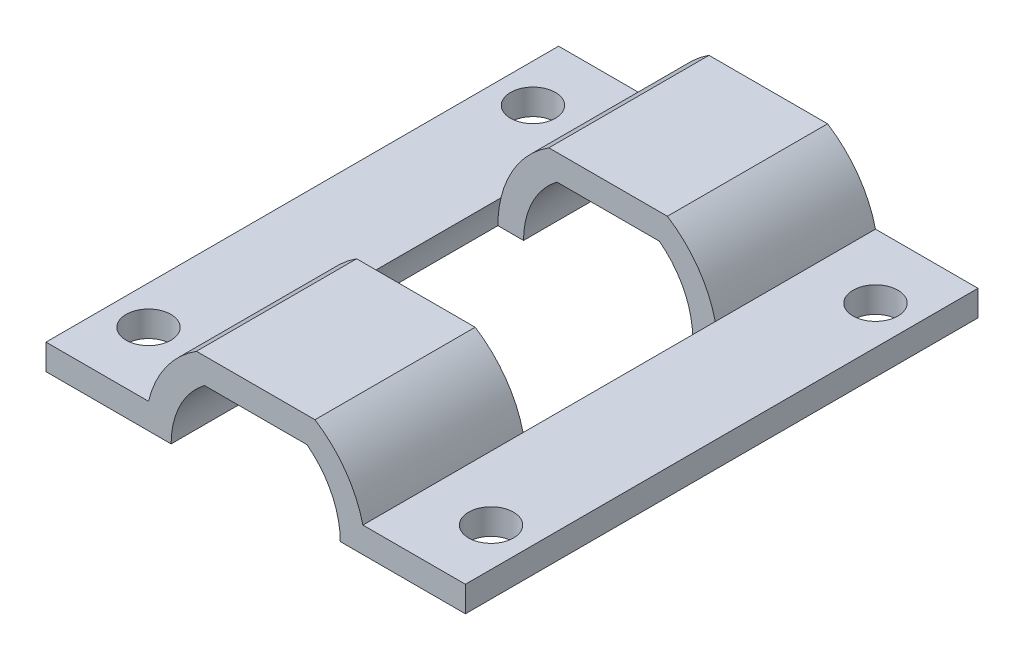
ISO-10303-21;
HEADER;
FILE_DESCRIPTION(('STEP AP214'),'2;1');
FILE_NAME('part.step','',(''),(''),'','','');
FILE_SCHEMA(('AUTOMOTIVE_DESIGN { 1 0 10303 214 1 1 1 1 }'));
ENDSEC;
DATA;
#1=APPLICATION_CONTEXT('core data for automotive mechanical design processes');
#2=APPLICATION_PROTOCOL_DEFINITION('international standard','automotive_design',2000,#1);
#3=PRODUCT_CONTEXT('',#1,'mechanical');
#4=PRODUCT('Part','Part','',(#3));
#5=PRODUCT_RELATED_PRODUCT_CATEGORY('part','',(#4));
#6=PRODUCT_DEFINITION_FORMATION('','',#4);
#7=PRODUCT_DEFINITION_CONTEXT('part definition',#1,'design');
#8=PRODUCT_DEFINITION('design','',#6,#7);
#9=PRODUCT_DEFINITION_SHAPE('','',#8);
#10=(LENGTH_UNIT() NAMED_UNIT(*) SI_UNIT(.MILLI.,.METRE.));
#11=(NAMED_UNIT(*) PLANE_ANGLE_UNIT() SI_UNIT($,.RADIAN.));
#12=(NAMED_UNIT(*) SI_UNIT($,.STERADIAN.) SOLID_ANGLE_UNIT());
#13=UNCERTAINTY_MEASURE_WITH_UNIT(LENGTH_MEASURE(1.E-05),#10,'distance_accuracy_value','');
#14=(GEOMETRIC_REPRESENTATION_CONTEXT(3) GLOBAL_UNCERTAINTY_ASSIGNED_CONTEXT((#13)) GLOBAL_UNIT_ASSIGNED_CONTEXT((#10,
#11,#12)) REPRESENTATION_CONTEXT('',''));
#15=CARTESIAN_POINT('',(0.,0.,0.));
#16=DIRECTION('',(0.,0.,1.));
#17=DIRECTION('',(1.,0.,0.));
#18=AXIS2_PLACEMENT_3D('',#15,#16,#17);
#19=CARTESIAN_POINT('',(0.,0.,20.));
#20=DIRECTION('',(0.,0.,-1.));
#21=DIRECTION('',(-1.,0.,0.));
#22=AXIS2_PLACEMENT_3D('',#19,#20,#21);
#23=CYLINDRICAL_SURFACE('',#22,8.6);
#24=CARTESIAN_POINT('',(0.,0.,-7.5));
#25=DIRECTION('',(0.,0.,1.));
#26=DIRECTION('',(1.,0.,0.));
#27=AXIS2_PLACEMENT_3D('',#24,#25,#26);
#28=CIRCLE('',#27,8.6);
#29=CARTESIAN_POINT('',(-4.62574318353278,7.25,-7.5));
#30=VERTEX_POINT('',#29);
#31=CARTESIAN_POINT('',(-8.36420946653059,2.,-7.5));
#32=VERTEX_POINT('',#31);
#33=EDGE_CURVE('E58',#30,#32,#28,.T.);
#34=ORIENTED_EDGE('',*,*,#33,.F.);
#35=DIRECTION('',(0.,0.,-1.));
#36=VECTOR('',#35,1.);
#37=CARTESIAN_POINT('',(-4.62574318353278,7.25,20.));
#38=LINE('',#37,#36);
#39=CARTESIAN_POINT('',(-4.62574318353278,7.25,-20.));
#40=VERTEX_POINT('',#39);
#41=EDGE_CURVE('E289',#30,#40,#38,.T.);
#42=ORIENTED_EDGE('',*,*,#41,.T.);
#43=CARTESIAN_POINT('',(0.,0.,-20.));
#44=DIRECTION('',(0.,0.,1.));
#45=DIRECTION('',(1.,0.,0.));
#46=AXIS2_PLACEMENT_3D('',#43,#44,#45);
#47=CIRCLE('',#46,8.6);
#48=CARTESIAN_POINT('',(-8.36420946653059,2.,-20.));
#49=VERTEX_POINT('',#48);
#50=EDGE_CURVE('E262',#40,#49,#47,.T.);
#51=ORIENTED_EDGE('',*,*,#50,.T.);
#52=DIRECTION('',(0.,0.,-1.));
#53=VECTOR('',#52,1.);
#54=CARTESIAN_POINT('',(-8.36420946653059,2.,20.));
#55=LINE('',#54,#53);
#56=EDGE_CURVE('E231',#32,#49,#55,.T.);
#57=ORIENTED_EDGE('',*,*,#56,.F.);
#58=EDGE_LOOP('',(#34,#42,#51,#57));
#59=FACE_BOUND('',#58,.T.);
#60=ADVANCED_FACE('F35',(#59),#23,.T.);
#61=CARTESIAN_POINT('',(0.,0.,20.));
#62=DIRECTION('',(0.,1.,0.));
#63=DIRECTION('',(0.,0.,1.));
#64=AXIS2_PLACEMENT_3D('',#61,#62,#63);
#65=PLANE('',#64);
#66=CARTESIAN_POINT('',(13.3642094665306,0.,-15.));
#67=DIRECTION('',(0.,-1.,0.));
#68=DIRECTION('',(0.,0.,1.));
#69=AXIS2_PLACEMENT_3D('',#66,#67,#68);
#70=CIRCLE('',#69,1.75);
#71=CARTESIAN_POINT('',(13.3642094665306,0.,-13.25));
#72=VERTEX_POINT('',#71);
#73=EDGE_CURVE('E479',#72,#72,#70,.T.);
#74=ORIENTED_EDGE('',*,*,#73,.F.);
#75=EDGE_LOOP('',(#74));
#76=FACE_BOUND('',#75,.T.);
#77=CARTESIAN_POINT('',(13.3642094665306,0.,15.));
#78=DIRECTION('',(0.,-1.,0.));
#79=DIRECTION('',(0.,0.,1.));
#80=AXIS2_PLACEMENT_3D('',#77,#78,#79);
#81=CIRCLE('',#80,1.75);
#82=CARTESIAN_POINT('',(13.3642094665306,0.,16.75));
#83=VERTEX_POINT('',#82);
#84=EDGE_CURVE('E486',#83,#83,#81,.T.);
#85=ORIENTED_EDGE('',*,*,#84,.F.);
#86=EDGE_LOOP('',(#85));
#87=FACE_BOUND('',#86,.T.);
#88=DIRECTION('',(-1.,0.,0.));
#89=VECTOR('',#88,1.);
#90=CARTESIAN_POINT('',(0.,0.,-7.5));
#91=LINE('',#90,#89);
#92=CARTESIAN_POINT('',(8.6,0.,-7.5));
#93=VERTEX_POINT('',#92);
#94=CARTESIAN_POINT('',(6.6,0.,-7.5));
#95=VERTEX_POINT('',#94);
#96=EDGE_CURVE('E184',#93,#95,#91,.T.);
#97=ORIENTED_EDGE('',*,*,#96,.T.);
#98=DIRECTION('',(0.,0.,-1.));
#99=VECTOR('',#98,1.);
#100=CARTESIAN_POINT('',(6.6,0.,20.));
#101=LINE('',#100,#99);
#102=CARTESIAN_POINT('',(6.6,0.,-20.));
#103=VERTEX_POINT('',#102);
#104=EDGE_CURVE('E256',#95,#103,#101,.T.);
#105=ORIENTED_EDGE('',*,*,#104,.T.);
#106=DIRECTION('',(1.,0.,0.));
#107=VECTOR('',#106,1.);
#108=CARTESIAN_POINT('',(0.,0.,-20.));
#109=LINE('',#108,#107);
#110=CARTESIAN_POINT('',(16.3642094665306,0.,-20.));
#111=VERTEX_POINT('',#110);
#112=EDGE_CURVE('E297',#103,#111,#109,.T.);
#113=ORIENTED_EDGE('',*,*,#112,.T.);
#114=DIRECTION('',(0.,0.,-1.));
#115=VECTOR('',#114,1.);
#116=CARTESIAN_POINT('',(16.3642094665306,0.,20.));
#117=LINE('',#116,#115);
#118=CARTESIAN_POINT('',(16.3642094665306,0.,20.));
#119=VERTEX_POINT('',#118);
#120=EDGE_CURVE('E11',#119,#111,#117,.T.);
#121=ORIENTED_EDGE('',*,*,#120,.F.);
#122=DIRECTION('',(1.,0.,0.));
#123=VECTOR('',#122,1.);
#124=CARTESIAN_POINT('',(0.,0.,20.));
#125=LINE('',#124,#123);
#126=CARTESIAN_POINT('',(6.6,0.,20.));
#127=VERTEX_POINT('',#126);
#128=EDGE_CURVE('E298',#127,#119,#125,.T.);
#129=ORIENTED_EDGE('',*,*,#128,.F.);
#130=CARTESIAN_POINT('',(6.6,0.,7.5));
#131=VERTEX_POINT('',#130);
#132=EDGE_CURVE('E275',#127,#131,#101,.T.);
#133=ORIENTED_EDGE('',*,*,#132,.T.);
#134=DIRECTION('',(-1.,0.,0.));
#135=VECTOR('',#134,1.);
#136=CARTESIAN_POINT('',(0.,0.,7.5));
#137=LINE('',#136,#135);
#138=CARTESIAN_POINT('',(8.6,0.,7.5));
#139=VERTEX_POINT('',#138);
#140=EDGE_CURVE('E50',#139,#131,#137,.T.);
#141=ORIENTED_EDGE('',*,*,#140,.F.);
#142=DIRECTION('',(0.,0.,1.));
#143=VECTOR('',#142,1.);
#144=CARTESIAN_POINT('',(8.6,0.,-7.5));
#145=LINE('',#144,#143);
#146=EDGE_CURVE('E200',#93,#139,#145,.T.);
#147=ORIENTED_EDGE('',*,*,#146,.F.);
#148=EDGE_LOOP('',(#97,#105,#113,#121,#129,#133,#141,#147));
#149=FACE_BOUND('',#148,.T.);
#150=ADVANCED_FACE('F37',(#76,#87,#149),#65,.F.);
#151=CARTESIAN_POINT('',(0.,0.,20.));
#152=DIRECTION('',(0.,0.,-1.));
#153=DIRECTION('',(-1.,0.,0.));
#154=AXIS2_PLACEMENT_3D('',#151,#152,#153);
#155=CYLINDRICAL_SURFACE('',#154,8.6);
#156=CARTESIAN_POINT('',(0.,0.,-7.5));
#157=DIRECTION('',(0.,0.,1.));
#158=DIRECTION('',(1.,0.,0.));
#159=AXIS2_PLACEMENT_3D('',#156,#157,#158);
#160=CIRCLE('',#159,8.6);
#161=CARTESIAN_POINT('',(8.36420946653059,2.,-7.5));
#162=VERTEX_POINT('',#161);
#163=CARTESIAN_POINT('',(4.62574318353278,7.25,-7.5));
#164=VERTEX_POINT('',#163);
#165=EDGE_CURVE('E194',#162,#164,#160,.T.);
#166=ORIENTED_EDGE('',*,*,#165,.F.);
#167=DIRECTION('',(0.,0.,-1.));
#168=VECTOR('',#167,1.);
#169=CARTESIAN_POINT('',(8.36420946653059,2.,20.));
#170=LINE('',#169,#168);
#171=CARTESIAN_POINT('',(8.36420946653059,2.,-20.));
#172=VERTEX_POINT('',#171);
#173=EDGE_CURVE('E306',#162,#172,#170,.T.);
#174=ORIENTED_EDGE('',*,*,#173,.T.);
#175=CARTESIAN_POINT('',(0.,0.,-20.));
#176=DIRECTION('',(0.,0.,1.));
#177=DIRECTION('',(1.,0.,0.));
#178=AXIS2_PLACEMENT_3D('',#175,#176,#177);
#179=CIRCLE('',#178,8.6);
#180=CARTESIAN_POINT('',(4.62574318353278,7.25,-20.));
#181=VERTEX_POINT('',#180);
#182=EDGE_CURVE('E235',#172,#181,#179,.T.);
#183=ORIENTED_EDGE('',*,*,#182,.T.);
#184=DIRECTION('',(0.,0.,-1.));
#185=VECTOR('',#184,1.);
#186=CARTESIAN_POINT('',(4.62574318353278,7.25,20.));
#187=LINE('',#186,#185);
#188=EDGE_CURVE('E293',#164,#181,#187,.T.);
#189=ORIENTED_EDGE('',*,*,#188,.F.);
#190=EDGE_LOOP('',(#166,#174,#183,#189));
#191=FACE_BOUND('',#190,.T.);
#192=ADVANCED_FACE('F335',(#191),#155,.T.);
#193=CARTESIAN_POINT('',(0.,7.25,20.));
#194=DIRECTION('',(0.,1.,0.));
#195=DIRECTION('',(0.,0.,1.));
#196=AXIS2_PLACEMENT_3D('',#193,#194,#195);
#197=PLANE('',#196);
#198=ORIENTED_EDGE('',*,*,#41,.F.);
#199=DIRECTION('',(1.,0.,0.));
#200=VECTOR('',#199,1.);
#201=CARTESIAN_POINT('',(0.,7.25,-7.5));
#202=LINE('',#201,#200);
#203=EDGE_CURVE('E203',#30,#164,#202,.T.);
#204=ORIENTED_EDGE('',*,*,#203,.T.);
#205=ORIENTED_EDGE('',*,*,#188,.T.);
#206=DIRECTION('',(1.,0.,0.));
#207=VECTOR('',#206,1.);
#208=CARTESIAN_POINT('',(0.,7.25,-20.));
#209=LINE('',#208,#207);
#210=EDGE_CURVE('E259',#40,#181,#209,.T.);
#211=ORIENTED_EDGE('',*,*,#210,.F.);
#212=EDGE_LOOP('',(#198,#204,#205,#211));
#213=FACE_BOUND('',#212,.T.);
#214=ADVANCED_FACE('F379',(#213),#197,.T.);
#215=CARTESIAN_POINT('',(0.,0.,20.));
#216=DIRECTION('',(0.,-1.,0.));
#217=DIRECTION('',(1.,0.,0.));
#218=AXIS2_PLACEMENT_3D('',#215,#216,#217);
#219=PLANE('',#218);
#220=CARTESIAN_POINT('',(-13.3642094665306,0.,-15.));
#221=DIRECTION('',(0.,1.,0.));
#222=DIRECTION('',(0.,0.,1.));
#223=AXIS2_PLACEMENT_3D('',#220,#221,#222);
#224=CIRCLE('',#223,1.75);
#225=CARTESIAN_POINT('',(-13.3642094665306,0.,-13.25));
#226=VERTEX_POINT('',#225);
#227=EDGE_CURVE('E390',#226,#226,#224,.T.);
#228=ORIENTED_EDGE('',*,*,#227,.T.);
#229=EDGE_LOOP('',(#228));
#230=FACE_BOUND('',#229,.T.);
#231=CARTESIAN_POINT('',(-13.3642094665306,0.,15.));
#232=DIRECTION('',(0.,1.,0.));
#233=DIRECTION('',(0.,0.,1.));
#234=AXIS2_PLACEMENT_3D('',#231,#232,#233);
#235=CIRCLE('',#234,1.75);
#236=CARTESIAN_POINT('',(-13.3642094665306,0.,16.75));
#237=VERTEX_POINT('',#236);
#238=EDGE_CURVE('E471',#237,#237,#235,.T.);
#239=ORIENTED_EDGE('',*,*,#238,.T.);
#240=EDGE_LOOP('',(#239));
#241=FACE_BOUND('',#240,.T.);
#242=DIRECTION('',(0.,0.,-1.));
#243=VECTOR('',#242,1.);
#244=CARTESIAN_POINT('',(-6.6,0.,20.));
#245=LINE('',#244,#243);
#246=CARTESIAN_POINT('',(-6.6,0.,-7.5));
#247=VERTEX_POINT('',#246);
#248=CARTESIAN_POINT('',(-6.6,0.,-20.));
#249=VERTEX_POINT('',#248);
#250=EDGE_CURVE('E285',#247,#249,#245,.T.);
#251=ORIENTED_EDGE('',*,*,#250,.F.);
#252=DIRECTION('',(-1.,0.,0.));
#253=VECTOR('',#252,1.);
#254=CARTESIAN_POINT('',(0.,0.,-7.5));
#255=LINE('',#254,#253);
#256=CARTESIAN_POINT('',(-8.6,0.,-7.5));
#257=VERTEX_POINT('',#256);
#258=EDGE_CURVE('E385',#247,#257,#255,.T.);
#259=ORIENTED_EDGE('',*,*,#258,.T.);
#260=DIRECTION('',(0.,0.,1.));
#261=VECTOR('',#260,1.);
#262=CARTESIAN_POINT('',(-8.6,0.,-7.5));
#263=LINE('',#262,#261);
#264=CARTESIAN_POINT('',(-8.6,0.,7.5));
#265=VERTEX_POINT('',#264);
#266=EDGE_CURVE('E206',#257,#265,#263,.T.);
#267=ORIENTED_EDGE('',*,*,#266,.T.);
#268=DIRECTION('',(-1.,0.,0.));
#269=VECTOR('',#268,1.);
#270=CARTESIAN_POINT('',(0.,0.,7.5));
#271=LINE('',#270,#269);
#272=CARTESIAN_POINT('',(-6.6,0.,7.5));
#273=VERTEX_POINT('',#272);
#274=EDGE_CURVE('E399',#273,#265,#271,.T.);
#275=ORIENTED_EDGE('',*,*,#274,.F.);
#276=CARTESIAN_POINT('',(-6.6,0.,20.));
#277=VERTEX_POINT('',#276);
#278=EDGE_CURVE('E286',#277,#273,#245,.T.);
#279=ORIENTED_EDGE('',*,*,#278,.F.);
#280=DIRECTION('',(-1.,0.,0.));
#281=VECTOR('',#280,1.);
#282=CARTESIAN_POINT('',(0.,0.,20.));
#283=LINE('',#282,#281);
#284=CARTESIAN_POINT('',(-16.3642094665306,0.,20.));
#285=VERTEX_POINT('',#284);
#286=EDGE_CURVE('E246',#277,#285,#283,.T.);
#287=ORIENTED_EDGE('',*,*,#286,.T.);
#288=DIRECTION('',(0.,0.,-1.));
#289=VECTOR('',#288,1.);
#290=CARTESIAN_POINT('',(-16.3642094665306,0.,20.));
#291=LINE('',#290,#289);
#292=CARTESIAN_POINT('',(-16.3642094665306,0.,-20.));
#293=VERTEX_POINT('',#292);
#294=EDGE_CURVE('E222',#285,#293,#291,.T.);
#295=ORIENTED_EDGE('',*,*,#294,.T.);
#296=DIRECTION('',(-1.,0.,0.));
#297=VECTOR('',#296,1.);
#298=CARTESIAN_POINT('',(0.,0.,-20.));
#299=LINE('',#298,#297);
#300=EDGE_CURVE('E265',#249,#293,#299,.T.);
#301=ORIENTED_EDGE('',*,*,#300,.F.);
#302=EDGE_LOOP('',(#251,#259,#267,#275,#279,#287,#295,#301));
#303=FACE_BOUND('',#302,.T.);
#304=ADVANCED_FACE('F364',(#230,#241,#303),#219,.T.);
#305=CARTESIAN_POINT('',(0.,0.,20.));
#306=DIRECTION('',(0.,0.,-1.));
#307=DIRECTION('',(-1.,0.,0.));
#308=AXIS2_PLACEMENT_3D('',#305,#306,#307);
#309=CYLINDRICAL_SURFACE('',#308,6.6);
#310=DIRECTION('',(0.,0.,-1.));
#311=VECTOR('',#310,1.);
#312=CARTESIAN_POINT('',(-3.99968748779202,5.25,20.));
#313=LINE('',#312,#311);
#314=CARTESIAN_POINT('',(-3.99968748779202,5.25,-7.5));
#315=VERTEX_POINT('',#314);
#316=CARTESIAN_POINT('',(-3.99968748779202,5.25,-20.));
#317=VERTEX_POINT('',#316);
#318=EDGE_CURVE('E281',#315,#317,#313,.T.);
#319=ORIENTED_EDGE('',*,*,#318,.F.);
#320=CARTESIAN_POINT('',(0.,0.,-7.5));
#321=DIRECTION('',(0.,0.,1.));
#322=DIRECTION('',(1.,0.,0.));
#323=AXIS2_PLACEMENT_3D('',#320,#321,#322);
#324=CIRCLE('',#323,6.6);
#325=EDGE_CURVE('E361',#315,#247,#324,.T.);
#326=ORIENTED_EDGE('',*,*,#325,.T.);
#327=ORIENTED_EDGE('',*,*,#250,.T.);
#328=CARTESIAN_POINT('',(0.,0.,-20.));
#329=DIRECTION('',(0.,0.,1.));
#330=DIRECTION('',(1.,0.,0.));
#331=AXIS2_PLACEMENT_3D('',#328,#329,#330);
#332=CIRCLE('',#331,6.6);
#333=EDGE_CURVE('E267',#317,#249,#332,.T.);
#334=ORIENTED_EDGE('',*,*,#333,.F.);
#335=EDGE_LOOP('',(#319,#326,#327,#334));
#336=FACE_BOUND('',#335,.T.);
#337=ADVANCED_FACE('F357',(#336),#309,.F.);
#338=CARTESIAN_POINT('',(0.,5.25,20.));
#339=DIRECTION('',(0.,1.,0.));
#340=DIRECTION('',(0.,0.,1.));
#341=AXIS2_PLACEMENT_3D('',#338,#339,#340);
#342=PLANE('',#341);
#343=DIRECTION('',(1.,0.,0.));
#344=VECTOR('',#343,1.);
#345=CARTESIAN_POINT('',(0.,5.25,-7.5));
#346=LINE('',#345,#344);
#347=CARTESIAN_POINT('',(3.99968748779202,5.25,-7.5));
#348=VERTEX_POINT('',#347);
#349=EDGE_CURVE('E210',#315,#348,#346,.T.);
#350=ORIENTED_EDGE('',*,*,#349,.F.);
#351=ORIENTED_EDGE('',*,*,#318,.T.);
#352=DIRECTION('',(1.,0.,0.));
#353=VECTOR('',#352,1.);
#354=CARTESIAN_POINT('',(0.,5.25,-20.));
#355=LINE('',#354,#353);
#356=CARTESIAN_POINT('',(3.99968748779202,5.25,-20.));
#357=VERTEX_POINT('',#356);
#358=EDGE_CURVE('E270',#317,#357,#355,.T.);
#359=ORIENTED_EDGE('',*,*,#358,.T.);
#360=DIRECTION('',(0.,0.,-1.));
#361=VECTOR('',#360,1.);
#362=CARTESIAN_POINT('',(3.99968748779202,5.25,20.));
#363=LINE('',#362,#361);
#364=EDGE_CURVE('E277',#348,#357,#363,.T.);
#365=ORIENTED_EDGE('',*,*,#364,.F.);
#366=EDGE_LOOP('',(#350,#351,#359,#365));
#367=FACE_BOUND('',#366,.T.);
#368=ADVANCED_FACE('F353',(#367),#342,.F.);
#369=CARTESIAN_POINT('',(0.,0.,20.));
#370=DIRECTION('',(0.,0.,-1.));
#371=DIRECTION('',(-1.,0.,0.));
#372=AXIS2_PLACEMENT_3D('',#369,#370,#371);
#373=CYLINDRICAL_SURFACE('',#372,6.6);
#374=ORIENTED_EDGE('',*,*,#104,.F.);
#375=CARTESIAN_POINT('',(0.,0.,-7.5));
#376=DIRECTION('',(0.,0.,1.));
#377=DIRECTION('',(1.,0.,0.));
#378=AXIS2_PLACEMENT_3D('',#375,#376,#377);
#379=CIRCLE('',#378,6.6);
#380=EDGE_CURVE('E190',#95,#348,#379,.T.);
#381=ORIENTED_EDGE('',*,*,#380,.T.);
#382=ORIENTED_EDGE('',*,*,#364,.T.);
#383=CARTESIAN_POINT('',(0.,0.,-20.));
#384=DIRECTION('',(0.,0.,1.));
#385=DIRECTION('',(1.,0.,0.));
#386=AXIS2_PLACEMENT_3D('',#383,#384,#385);
#387=CIRCLE('',#386,6.6);
#388=EDGE_CURVE('E240',#103,#357,#387,.T.);
#389=ORIENTED_EDGE('',*,*,#388,.F.);
#390=EDGE_LOOP('',(#374,#381,#382,#389));
#391=FACE_BOUND('',#390,.T.);
#392=ADVANCED_FACE('F349',(#391),#373,.F.);
#393=CARTESIAN_POINT('',(-4.62574318353278,7.25,20.));
#394=VERTEX_POINT('',#393);
#395=CARTESIAN_POINT('',(-4.62574318353278,7.25,7.5));
#396=VERTEX_POINT('',#395);
#397=EDGE_CURVE('E290',#394,#396,#38,.T.);
#398=ORIENTED_EDGE('',*,*,#397,.T.);
#399=CARTESIAN_POINT('',(0.,0.,7.5));
#400=DIRECTION('',(0.,0.,1.));
#401=DIRECTION('',(1.,0.,0.));
#402=AXIS2_PLACEMENT_3D('',#399,#400,#401);
#403=CIRCLE('',#402,8.6);
#404=CARTESIAN_POINT('',(-8.36420946653059,2.,7.5));
#405=VERTEX_POINT('',#404);
#406=EDGE_CURVE('E396',#396,#405,#403,.T.);
#407=ORIENTED_EDGE('',*,*,#406,.T.);
#408=CARTESIAN_POINT('',(-8.36420946653059,2.,20.));
#409=VERTEX_POINT('',#408);
#410=EDGE_CURVE('E232',#409,#405,#55,.T.);
#411=ORIENTED_EDGE('',*,*,#410,.F.);
#412=CARTESIAN_POINT('',(0.,0.,20.));
#413=DIRECTION('',(0.,0.,1.));
#414=DIRECTION('',(1.,0.,0.));
#415=AXIS2_PLACEMENT_3D('',#412,#413,#414);
#416=CIRCLE('',#415,8.6);
#417=EDGE_CURVE('E243',#394,#409,#416,.T.);
#418=ORIENTED_EDGE('',*,*,#417,.F.);
#419=EDGE_LOOP('',(#398,#407,#411,#418));
#420=FACE_BOUND('',#419,.T.);
#421=ADVANCED_FACE('F425',(#420),#23,.T.);
#422=CARTESIAN_POINT('',(16.3642094665306,0.,20.));
#423=DIRECTION('',(-1.,0.,0.));
#424=DIRECTION('',(0.,0.,1.));
#425=AXIS2_PLACEMENT_3D('',#422,#423,#424);
#426=PLANE('',#425);
#427=DIRECTION('',(0.,1.,0.));
#428=VECTOR('',#427,1.);
#429=CARTESIAN_POINT('',(16.3642094665306,0.,-20.));
#430=LINE('',#429,#428);
#431=CARTESIAN_POINT('',(16.3642094665306,2.,-20.));
#432=VERTEX_POINT('',#431);
#433=EDGE_CURVE('E308',#111,#432,#430,.T.);
#434=ORIENTED_EDGE('',*,*,#433,.T.);
#435=DIRECTION('',(0.,0.,-1.));
#436=VECTOR('',#435,1.);
#437=CARTESIAN_POINT('',(16.3642094665306,2.,20.));
#438=LINE('',#437,#436);
#439=CARTESIAN_POINT('',(16.3642094665306,2.,20.));
#440=VERTEX_POINT('',#439);
#441=EDGE_CURVE('E43',#440,#432,#438,.T.);
#442=ORIENTED_EDGE('',*,*,#441,.F.);
#443=DIRECTION('',(0.,1.,0.));
#444=VECTOR('',#443,1.);
#445=CARTESIAN_POINT('',(16.3642094665306,0.,20.));
#446=LINE('',#445,#444);
#447=EDGE_CURVE('E300',#119,#440,#446,.T.);
#448=ORIENTED_EDGE('',*,*,#447,.F.);
#449=ORIENTED_EDGE('',*,*,#120,.T.);
#450=EDGE_LOOP('',(#434,#442,#448,#449));
#451=FACE_BOUND('',#450,.T.);
#452=ADVANCED_FACE('F325',(#451),#426,.F.);
#453=CARTESIAN_POINT('',(0.,2.,20.));
#454=DIRECTION('',(0.,1.,0.));
#455=DIRECTION('',(0.,0.,1.));
#456=AXIS2_PLACEMENT_3D('',#453,#454,#455);
#457=PLANE('',#456);
#458=CARTESIAN_POINT('',(13.3642094665306,2.,-15.));
#459=DIRECTION('',(0.,-1.,0.));
#460=DIRECTION('',(0.,0.,1.));
#461=AXIS2_PLACEMENT_3D('',#458,#459,#460);
#462=CIRCLE('',#461,1.75);
#463=CARTESIAN_POINT('',(13.3642094665306,2.,-13.25));
#464=VERTEX_POINT('',#463);
#465=EDGE_CURVE('E489',#464,#464,#462,.T.);
#466=ORIENTED_EDGE('',*,*,#465,.T.);
#467=EDGE_LOOP('',(#466));
#468=FACE_BOUND('',#467,.T.);
#469=CARTESIAN_POINT('',(13.3642094665306,2.,15.));
#470=DIRECTION('',(0.,-1.,0.));
#471=DIRECTION('',(0.,0.,1.));
#472=AXIS2_PLACEMENT_3D('',#469,#470,#471);
#473=CIRCLE('',#472,1.75);
#474=CARTESIAN_POINT('',(13.3642094665306,2.,16.75));
#475=VERTEX_POINT('',#474);
#476=EDGE_CURVE('E483',#475,#475,#473,.T.);
#477=ORIENTED_EDGE('',*,*,#476,.T.);
#478=EDGE_LOOP('',(#477));
#479=FACE_BOUND('',#478,.T.);
#480=DIRECTION('',(1.,0.,0.));
#481=VECTOR('',#480,1.);
#482=CARTESIAN_POINT('',(0.,2.,-20.));
#483=LINE('',#482,#481);
#484=EDGE_CURVE('E301',#172,#432,#483,.T.);
#485=ORIENTED_EDGE('',*,*,#484,.F.);
#486=ORIENTED_EDGE('',*,*,#173,.F.);
#487=DIRECTION('',(0.,0.,1.));
#488=VECTOR('',#487,1.);
#489=CARTESIAN_POINT('',(8.36420946653059,2.,-7.5));
#490=LINE('',#489,#488);
#491=CARTESIAN_POINT('',(8.36420946653059,2.,7.5));
#492=VERTEX_POINT('',#491);
#493=EDGE_CURVE('E202',#492,#162,#490,.F.);
#494=ORIENTED_EDGE('',*,*,#493,.F.);
#495=CARTESIAN_POINT('',(8.36420946653059,2.,20.));
#496=VERTEX_POINT('',#495);
#497=EDGE_CURVE('E313',#496,#492,#170,.T.);
#498=ORIENTED_EDGE('',*,*,#497,.F.);
#499=DIRECTION('',(1.,0.,0.));
#500=VECTOR('',#499,1.);
#501=CARTESIAN_POINT('',(0.,2.,20.));
#502=LINE('',#501,#500);
#503=EDGE_CURVE('E303',#496,#440,#502,.T.);
#504=ORIENTED_EDGE('',*,*,#503,.T.);
#505=ORIENTED_EDGE('',*,*,#441,.T.);
#506=EDGE_LOOP('',(#485,#486,#494,#498,#504,#505));
#507=FACE_BOUND('',#506,.T.);
#508=ADVANCED_FACE('F318',(#468,#479,#507),#457,.T.);
#509=CARTESIAN_POINT('',(0.,0.,20.));
#510=DIRECTION('',(0.,0.,1.));
#511=DIRECTION('',(1.,0.,0.));
#512=AXIS2_PLACEMENT_3D('',#509,#510,#511);
#513=PLANE('',#512);
#514=ORIENTED_EDGE('',*,*,#503,.F.);
#515=CARTESIAN_POINT('',(0.,0.,20.));
#516=DIRECTION('',(0.,0.,1.));
#517=DIRECTION('',(1.,0.,0.));
#518=AXIS2_PLACEMENT_3D('',#515,#516,#517);
#519=CIRCLE('',#518,8.6);
#520=CARTESIAN_POINT('',(4.62574318353278,7.25,20.));
#521=VERTEX_POINT('',#520);
#522=EDGE_CURVE('E237',#496,#521,#519,.T.);
#523=ORIENTED_EDGE('',*,*,#522,.T.);
#524=DIRECTION('',(1.,0.,0.));
#525=VECTOR('',#524,1.);
#526=CARTESIAN_POINT('',(0.,7.25,20.));
#527=LINE('',#526,#525);
#528=EDGE_CURVE('E239',#394,#521,#527,.T.);
#529=ORIENTED_EDGE('',*,*,#528,.F.);
#530=ORIENTED_EDGE('',*,*,#417,.T.);
#531=DIRECTION('',(-1.,0.,0.));
#532=VECTOR('',#531,1.);
#533=CARTESIAN_POINT('',(0.,2.,20.));
#534=LINE('',#533,#532);
#535=CARTESIAN_POINT('',(-16.3642094665306,2.,20.));
#536=VERTEX_POINT('',#535);
#537=EDGE_CURVE('E216',#409,#536,#534,.T.);
#538=ORIENTED_EDGE('',*,*,#537,.T.);
#539=DIRECTION('',(0.,1.,0.));
#540=VECTOR('',#539,1.);
#541=CARTESIAN_POINT('',(-16.3642094665306,0.,20.));
#542=LINE('',#541,#540);
#543=EDGE_CURVE('E218',#285,#536,#542,.T.);
#544=ORIENTED_EDGE('',*,*,#543,.F.);
#545=ORIENTED_EDGE('',*,*,#286,.F.);
#546=CARTESIAN_POINT('',(0.,0.,20.));
#547=DIRECTION('',(0.,0.,1.));
#548=DIRECTION('',(1.,0.,0.));
#549=AXIS2_PLACEMENT_3D('',#546,#547,#548);
#550=CIRCLE('',#549,6.6);
#551=CARTESIAN_POINT('',(-3.99968748779202,5.25,20.));
#552=VERTEX_POINT('',#551);
#553=EDGE_CURVE('E248',#552,#277,#550,.T.);
#554=ORIENTED_EDGE('',*,*,#553,.F.);
#555=DIRECTION('',(1.,0.,0.));
#556=VECTOR('',#555,1.);
#557=CARTESIAN_POINT('',(0.,5.25,20.));
#558=LINE('',#557,#556);
#559=CARTESIAN_POINT('',(3.99968748779202,5.25,20.));
#560=VERTEX_POINT('',#559);
#561=EDGE_CURVE('E251',#552,#560,#558,.T.);
#562=ORIENTED_EDGE('',*,*,#561,.T.);
#563=CARTESIAN_POINT('',(0.,0.,20.));
#564=DIRECTION('',(0.,0.,1.));
#565=DIRECTION('',(1.,0.,0.));
#566=AXIS2_PLACEMENT_3D('',#563,#564,#565);
#567=CIRCLE('',#566,6.6);
#568=EDGE_CURVE('E253',#127,#560,#567,.T.);
#569=ORIENTED_EDGE('',*,*,#568,.F.);
#570=ORIENTED_EDGE('',*,*,#128,.T.);
#571=ORIENTED_EDGE('',*,*,#447,.T.);
#572=EDGE_LOOP('',(#514,#523,#529,#530,#538,#544,#545,#554,#562,#569,#570,#571));
#573=FACE_BOUND('',#572,.T.);
#574=ADVANCED_FACE('F343',(#573),#513,.T.);
#575=CARTESIAN_POINT('',(0.,0.,-20.));
#576=DIRECTION('',(0.,0.,1.));
#577=DIRECTION('',(1.,0.,0.));
#578=AXIS2_PLACEMENT_3D('',#575,#576,#577);
#579=PLANE('',#578);
#580=ORIENTED_EDGE('',*,*,#112,.F.);
#581=ORIENTED_EDGE('',*,*,#388,.T.);
#582=ORIENTED_EDGE('',*,*,#358,.F.);
#583=ORIENTED_EDGE('',*,*,#333,.T.);
#584=ORIENTED_EDGE('',*,*,#300,.T.);
#585=DIRECTION('',(0.,1.,0.));
#586=VECTOR('',#585,1.);
#587=CARTESIAN_POINT('',(-16.3642094665306,0.,-20.));
#588=LINE('',#587,#586);
#589=CARTESIAN_POINT('',(-16.3642094665306,2.,-20.));
#590=VERTEX_POINT('',#589);
#591=EDGE_CURVE('E219',#293,#590,#588,.T.);
#592=ORIENTED_EDGE('',*,*,#591,.T.);
#593=DIRECTION('',(-1.,0.,0.));
#594=VECTOR('',#593,1.);
#595=CARTESIAN_POINT('',(0.,2.,-20.));
#596=LINE('',#595,#594);
#597=EDGE_CURVE('E215',#49,#590,#596,.T.);
#598=ORIENTED_EDGE('',*,*,#597,.F.);
#599=ORIENTED_EDGE('',*,*,#50,.F.);
#600=ORIENTED_EDGE('',*,*,#210,.T.);
#601=ORIENTED_EDGE('',*,*,#182,.F.);
#602=ORIENTED_EDGE('',*,*,#484,.T.);
#603=ORIENTED_EDGE('',*,*,#433,.F.);
#604=EDGE_LOOP('',(#580,#581,#582,#583,#584,#592,#598,#599,#600,#601,#602,#603));
#605=FACE_BOUND('',#604,.T.);
#606=ADVANCED_FACE('F330',(#605),#579,.F.);
#607=ORIENTED_EDGE('',*,*,#497,.T.);
#608=CARTESIAN_POINT('',(0.,0.,7.5));
#609=DIRECTION('',(0.,0.,1.));
#610=DIRECTION('',(1.,0.,0.));
#611=AXIS2_PLACEMENT_3D('',#608,#609,#610);
#612=CIRCLE('',#611,8.6);
#613=CARTESIAN_POINT('',(4.62574318353278,7.25,7.5));
#614=VERTEX_POINT('',#613);
#615=EDGE_CURVE('E340',#492,#614,#612,.T.);
#616=ORIENTED_EDGE('',*,*,#615,.T.);
#617=EDGE_CURVE('E294',#521,#614,#187,.T.);
#618=ORIENTED_EDGE('',*,*,#617,.F.);
#619=ORIENTED_EDGE('',*,*,#522,.F.);
#620=EDGE_LOOP('',(#607,#616,#618,#619));
#621=FACE_BOUND('',#620,.T.);
#622=ADVANCED_FACE('F338',(#621),#155,.T.);
#623=DIRECTION('',(1.,0.,0.));
#624=VECTOR('',#623,1.);
#625=CARTESIAN_POINT('',(0.,7.25,7.5));
#626=LINE('',#625,#624);
#627=EDGE_CURVE('E393',#396,#614,#626,.T.);
#628=ORIENTED_EDGE('',*,*,#627,.F.);
#629=ORIENTED_EDGE('',*,*,#397,.F.);
#630=ORIENTED_EDGE('',*,*,#528,.T.);
#631=ORIENTED_EDGE('',*,*,#617,.T.);
#632=EDGE_LOOP('',(#628,#629,#630,#631));
#633=FACE_BOUND('',#632,.T.);
#634=ADVANCED_FACE('F443',(#633),#197,.T.);
#635=CARTESIAN_POINT('',(0.,0.,7.5));
#636=DIRECTION('',(0.,0.,1.));
#637=DIRECTION('',(1.,0.,0.));
#638=AXIS2_PLACEMENT_3D('',#635,#636,#637);
#639=CIRCLE('',#638,6.6);
#640=CARTESIAN_POINT('',(-3.99968748779202,5.25,7.5));
#641=VERTEX_POINT('',#640);
#642=EDGE_CURVE('E402',#641,#273,#639,.T.);
#643=ORIENTED_EDGE('',*,*,#642,.F.);
#644=EDGE_CURVE('E282',#552,#641,#313,.T.);
#645=ORIENTED_EDGE('',*,*,#644,.F.);
#646=ORIENTED_EDGE('',*,*,#553,.T.);
#647=ORIENTED_EDGE('',*,*,#278,.T.);
#648=EDGE_LOOP('',(#643,#645,#646,#647));
#649=FACE_BOUND('',#648,.T.);
#650=ADVANCED_FACE('F422',(#649),#309,.F.);
#651=ORIENTED_EDGE('',*,*,#644,.T.);
#652=DIRECTION('',(1.,0.,0.));
#653=VECTOR('',#652,1.);
#654=CARTESIAN_POINT('',(0.,5.25,7.5));
#655=LINE('',#654,#653);
#656=CARTESIAN_POINT('',(3.99968748779202,5.25,7.5));
#657=VERTEX_POINT('',#656);
#658=EDGE_CURVE('E404',#641,#657,#655,.T.);
#659=ORIENTED_EDGE('',*,*,#658,.T.);
#660=EDGE_CURVE('E278',#560,#657,#363,.T.);
#661=ORIENTED_EDGE('',*,*,#660,.F.);
#662=ORIENTED_EDGE('',*,*,#561,.F.);
#663=EDGE_LOOP('',(#651,#659,#661,#662));
#664=FACE_BOUND('',#663,.T.);
#665=ADVANCED_FACE('F411',(#664),#342,.F.);
#666=CARTESIAN_POINT('',(0.,0.,7.5));
#667=DIRECTION('',(0.,0.,1.));
#668=DIRECTION('',(1.,0.,0.));
#669=AXIS2_PLACEMENT_3D('',#666,#667,#668);
#670=CIRCLE('',#669,6.6);
#671=EDGE_CURVE('E195',#131,#657,#670,.T.);
#672=ORIENTED_EDGE('',*,*,#671,.F.);
#673=ORIENTED_EDGE('',*,*,#132,.F.);
#674=ORIENTED_EDGE('',*,*,#568,.T.);
#675=ORIENTED_EDGE('',*,*,#660,.T.);
#676=EDGE_LOOP('',(#672,#673,#674,#675));
#677=FACE_BOUND('',#676,.T.);
#678=ADVANCED_FACE('F413',(#677),#373,.F.);
#679=CARTESIAN_POINT('',(0.,2.,20.));
#680=DIRECTION('',(0.,-1.,0.));
#681=DIRECTION('',(0.,0.,-1.));
#682=AXIS2_PLACEMENT_3D('',#679,#680,#681);
#683=PLANE('',#682);
#684=CARTESIAN_POINT('',(-13.3642094665306,2.,-15.));
#685=DIRECTION('',(0.,1.,0.));
#686=DIRECTION('',(0.,0.,1.));
#687=AXIS2_PLACEMENT_3D('',#684,#685,#686);
#688=CIRCLE('',#687,1.75);
#689=CARTESIAN_POINT('',(-13.3642094665306,2.,-13.25));
#690=VERTEX_POINT('',#689);
#691=EDGE_CURVE('E473',#690,#690,#688,.T.);
#692=ORIENTED_EDGE('',*,*,#691,.F.);
#693=EDGE_LOOP('',(#692));
#694=FACE_BOUND('',#693,.T.);
#695=CARTESIAN_POINT('',(-13.3642094665306,2.,15.));
#696=DIRECTION('',(0.,1.,0.));
#697=DIRECTION('',(0.,0.,1.));
#698=AXIS2_PLACEMENT_3D('',#695,#696,#697);
#699=CIRCLE('',#698,1.75);
#700=CARTESIAN_POINT('',(-13.3642094665306,2.,16.75));
#701=VERTEX_POINT('',#700);
#702=EDGE_CURVE('E474',#701,#701,#699,.T.);
#703=ORIENTED_EDGE('',*,*,#702,.F.);
#704=EDGE_LOOP('',(#703));
#705=FACE_BOUND('',#704,.T.);
#706=ORIENTED_EDGE('',*,*,#597,.T.);
#707=DIRECTION('',(0.,0.,-1.));
#708=VECTOR('',#707,1.);
#709=CARTESIAN_POINT('',(-16.3642094665306,2.,20.));
#710=LINE('',#709,#708);
#711=EDGE_CURVE('E229',#536,#590,#710,.T.);
#712=ORIENTED_EDGE('',*,*,#711,.F.);
#713=ORIENTED_EDGE('',*,*,#537,.F.);
#714=ORIENTED_EDGE('',*,*,#410,.T.);
#715=EDGE_CURVE('E236',#405,#32,#55,.T.);
#716=ORIENTED_EDGE('',*,*,#715,.T.);
#717=ORIENTED_EDGE('',*,*,#56,.T.);
#718=EDGE_LOOP('',(#706,#712,#713,#714,#716,#717));
#719=FACE_BOUND('',#718,.T.);
#720=ADVANCED_FACE('F373',(#694,#705,#719),#683,.F.);
#721=CARTESIAN_POINT('',(-16.3642094665306,0.,20.));
#722=DIRECTION('',(-1.,0.,0.));
#723=DIRECTION('',(0.,0.,1.));
#724=AXIS2_PLACEMENT_3D('',#721,#722,#723);
#725=PLANE('',#724);
#726=ORIENTED_EDGE('',*,*,#591,.F.);
#727=ORIENTED_EDGE('',*,*,#294,.F.);
#728=ORIENTED_EDGE('',*,*,#543,.T.);
#729=ORIENTED_EDGE('',*,*,#711,.T.);
#730=EDGE_LOOP('',(#726,#727,#728,#729));
#731=FACE_BOUND('',#730,.T.);
#732=ADVANCED_FACE('F369',(#731),#725,.T.);
#733=CARTESIAN_POINT('',(0.,0.,-7.5));
#734=DIRECTION('',(0.,0.,1.));
#735=DIRECTION('',(1.,0.,0.));
#736=AXIS2_PLACEMENT_3D('',#733,#734,#735);
#737=CYLINDRICAL_SURFACE('',#736,8.6);
#738=EDGE_CURVE('E395',#405,#265,#403,.T.);
#739=ORIENTED_EDGE('',*,*,#738,.T.);
#740=ORIENTED_EDGE('',*,*,#266,.F.);
#741=EDGE_CURVE('E381',#32,#257,#28,.T.);
#742=ORIENTED_EDGE('',*,*,#741,.F.);
#743=ORIENTED_EDGE('',*,*,#715,.F.);
#744=EDGE_LOOP('',(#739,#740,#742,#743));
#745=FACE_BOUND('',#744,.T.);
#746=ADVANCED_FACE('F448',(#745),#737,.F.);
#747=CARTESIAN_POINT('',(0.,0.,-7.5));
#748=DIRECTION('',(0.,0.,1.));
#749=DIRECTION('',(1.,0.,0.));
#750=AXIS2_PLACEMENT_3D('',#747,#748,#749);
#751=CYLINDRICAL_SURFACE('',#750,8.6);
#752=ORIENTED_EDGE('',*,*,#493,.T.);
#753=EDGE_CURVE('E187',#93,#162,#160,.T.);
#754=ORIENTED_EDGE('',*,*,#753,.F.);
#755=ORIENTED_EDGE('',*,*,#146,.T.);
#756=EDGE_CURVE('E391',#139,#492,#612,.T.);
#757=ORIENTED_EDGE('',*,*,#756,.T.);
#758=EDGE_LOOP('',(#752,#754,#755,#757));
#759=FACE_BOUND('',#758,.T.);
#760=ADVANCED_FACE('F198',(#759),#751,.F.);
#761=CARTESIAN_POINT('',(0.,0.,-7.5));
#762=DIRECTION('',(0.,0.,1.));
#763=DIRECTION('',(1.,0.,0.));
#764=AXIS2_PLACEMENT_3D('',#761,#762,#763);
#765=PLANE('',#764);
#766=ORIENTED_EDGE('',*,*,#96,.F.);
#767=ORIENTED_EDGE('',*,*,#753,.T.);
#768=ORIENTED_EDGE('',*,*,#165,.T.);
#769=ORIENTED_EDGE('',*,*,#203,.F.);
#770=ORIENTED_EDGE('',*,*,#33,.T.);
#771=ORIENTED_EDGE('',*,*,#741,.T.);
#772=ORIENTED_EDGE('',*,*,#258,.F.);
#773=ORIENTED_EDGE('',*,*,#325,.F.);
#774=ORIENTED_EDGE('',*,*,#349,.T.);
#775=ORIENTED_EDGE('',*,*,#380,.F.);
#776=EDGE_LOOP('',(#766,#767,#768,#769,#770,#771,#772,#773,#774,#775));
#777=FACE_BOUND('',#776,.T.);
#778=ADVANCED_FACE('F186',(#777),#765,.T.);
#779=CARTESIAN_POINT('',(0.,0.,7.5));
#780=DIRECTION('',(0.,0.,1.));
#781=DIRECTION('',(1.,0.,0.));
#782=AXIS2_PLACEMENT_3D('',#779,#780,#781);
#783=PLANE('',#782);
#784=ORIENTED_EDGE('',*,*,#140,.T.);
#785=ORIENTED_EDGE('',*,*,#671,.T.);
#786=ORIENTED_EDGE('',*,*,#658,.F.);
#787=ORIENTED_EDGE('',*,*,#642,.T.);
#788=ORIENTED_EDGE('',*,*,#274,.T.);
#789=ORIENTED_EDGE('',*,*,#738,.F.);
#790=ORIENTED_EDGE('',*,*,#406,.F.);
#791=ORIENTED_EDGE('',*,*,#627,.T.);
#792=ORIENTED_EDGE('',*,*,#615,.F.);
#793=ORIENTED_EDGE('',*,*,#756,.F.);
#794=EDGE_LOOP('',(#784,#785,#786,#787,#788,#789,#790,#791,#792,#793));
#795=FACE_BOUND('',#794,.T.);
#796=ADVANCED_FACE('F406',(#795),#783,.F.);
#797=CARTESIAN_POINT('',(-13.3642094665306,0.,15.));
#798=DIRECTION('',(0.,1.,0.));
#799=DIRECTION('',(0.,0.,1.));
#800=AXIS2_PLACEMENT_3D('',#797,#798,#799);
#801=CYLINDRICAL_SURFACE('',#800,1.75);
#802=ORIENTED_EDGE('',*,*,#238,.F.);
#803=EDGE_LOOP('',(#802));
#804=FACE_BOUND('',#803,.T.);
#805=ORIENTED_EDGE('',*,*,#702,.T.);
#806=EDGE_LOOP('',(#805));
#807=FACE_BOUND('',#806,.T.);
#808=ADVANCED_FACE('F612',(#804,#807),#801,.F.);
#809=CARTESIAN_POINT('',(-13.3642094665306,0.,-15.));
#810=DIRECTION('',(0.,1.,0.));
#811=DIRECTION('',(0.,0.,1.));
#812=AXIS2_PLACEMENT_3D('',#809,#810,#811);
#813=CYLINDRICAL_SURFACE('',#812,1.75);
#814=ORIENTED_EDGE('',*,*,#227,.F.);
#815=EDGE_LOOP('',(#814));
#816=FACE_BOUND('',#815,.T.);
#817=ORIENTED_EDGE('',*,*,#691,.T.);
#818=EDGE_LOOP('',(#817));
#819=FACE_BOUND('',#818,.T.);
#820=ADVANCED_FACE('F503',(#816,#819),#813,.F.);
#821=CARTESIAN_POINT('',(13.3642094665306,0.,15.));
#822=DIRECTION('',(0.,1.,0.));
#823=DIRECTION('',(0.,0.,1.));
#824=AXIS2_PLACEMENT_3D('',#821,#822,#823);
#825=CYLINDRICAL_SURFACE('',#824,1.75);
#826=ORIENTED_EDGE('',*,*,#84,.T.);
#827=EDGE_LOOP('',(#826));
#828=FACE_BOUND('',#827,.T.);
#829=ORIENTED_EDGE('',*,*,#476,.F.);
#830=EDGE_LOOP('',(#829));
#831=FACE_BOUND('',#830,.T.);
#832=ADVANCED_FACE('F500',(#828,#831),#825,.F.);
#833=CARTESIAN_POINT('',(13.3642094665306,0.,-15.));
#834=DIRECTION('',(0.,1.,0.));
#835=DIRECTION('',(0.,0.,1.));
#836=AXIS2_PLACEMENT_3D('',#833,#834,#835);
#837=CYLINDRICAL_SURFACE('',#836,1.75);
#838=ORIENTED_EDGE('',*,*,#73,.T.);
#839=EDGE_LOOP('',(#838));
#840=FACE_BOUND('',#839,.T.);
#841=ORIENTED_EDGE('',*,*,#465,.F.);
#842=EDGE_LOOP('',(#841));
#843=FACE_BOUND('',#842,.T.);
#844=ADVANCED_FACE('F495',(#840,#843),#837,.F.);
#845=CLOSED_SHELL('',(#60,#150,#192,#214,#304,#337,#368,#392,#421,#452,#508,#574,#606,#622,#634,
#650,#665,#678,#720,#732,#746,#760,#778,#796,#808,#820,#832,#844));
#846=MANIFOLD_SOLID_BREP('B2',#845);
#847=ADVANCED_BREP_SHAPE_REPRESENTATION('',(#18,#846),#14);
#848=SHAPE_DEFINITION_REPRESENTATION(#9,#847);
ENDSEC;
END-ISO-10303-21;
